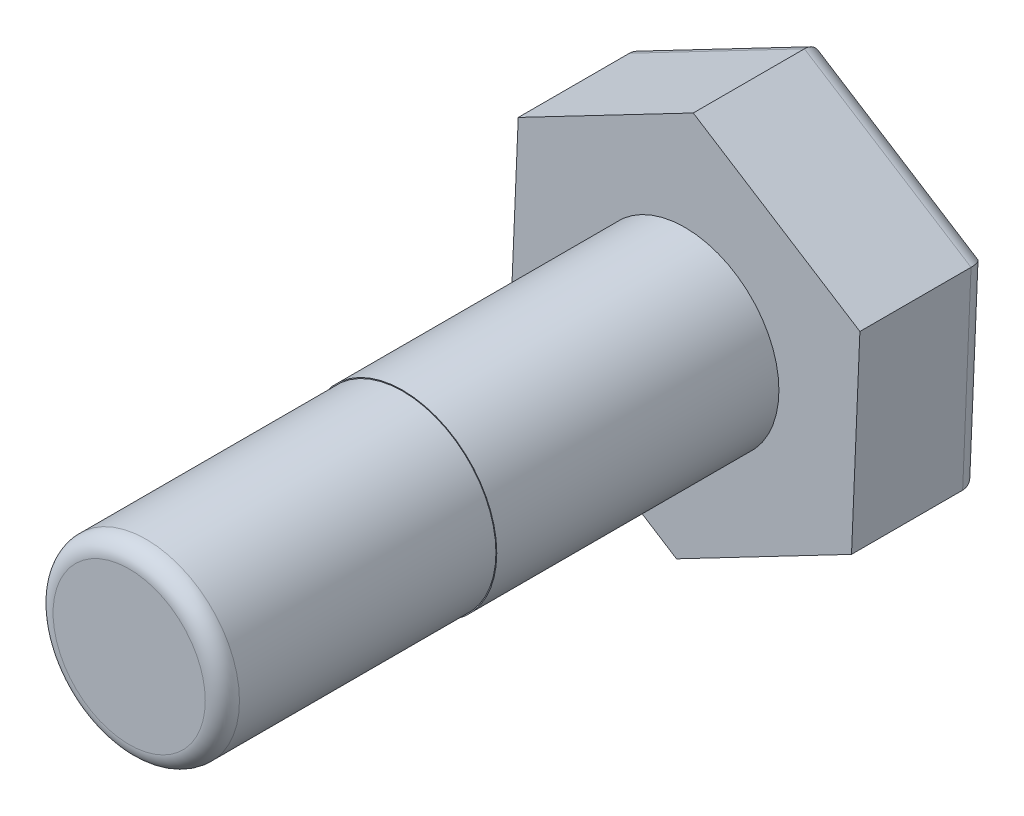
ISO-10303-21;
HEADER;
FILE_DESCRIPTION(('STEP AP214'),'2;1');
FILE_NAME('part.step','',(''),(''),'','','');
FILE_SCHEMA(('AUTOMOTIVE_DESIGN { 1 0 10303 214 1 1 1 1 }'));
ENDSEC;
DATA;
#1=APPLICATION_CONTEXT('core data for automotive mechanical design processes');
#2=APPLICATION_PROTOCOL_DEFINITION('international standard','automotive_design',2000,#1);
#3=PRODUCT_CONTEXT('',#1,'mechanical');
#4=PRODUCT('Part','Part','',(#3));
#5=PRODUCT_RELATED_PRODUCT_CATEGORY('part','',(#4));
#6=PRODUCT_DEFINITION_FORMATION('','',#4);
#7=PRODUCT_DEFINITION_CONTEXT('part definition',#1,'design');
#8=PRODUCT_DEFINITION('design','',#6,#7);
#9=PRODUCT_DEFINITION_SHAPE('','',#8);
#10=(LENGTH_UNIT() NAMED_UNIT(*) SI_UNIT(.MILLI.,.METRE.));
#11=(NAMED_UNIT(*) PLANE_ANGLE_UNIT() SI_UNIT($,.RADIAN.));
#12=(NAMED_UNIT(*) SI_UNIT($,.STERADIAN.) SOLID_ANGLE_UNIT());
#13=UNCERTAINTY_MEASURE_WITH_UNIT(LENGTH_MEASURE(1.E-05),#10,'distance_accuracy_value','');
#14=(GEOMETRIC_REPRESENTATION_CONTEXT(3) GLOBAL_UNCERTAINTY_ASSIGNED_CONTEXT((#13)) GLOBAL_UNIT_ASSIGNED_CONTEXT((#10,
#11,#12)) REPRESENTATION_CONTEXT('',''));
#15=CARTESIAN_POINT('',(0.,0.,0.));
#16=DIRECTION('',(0.,0.,1.));
#17=DIRECTION('',(1.,0.,0.));
#18=AXIS2_PLACEMENT_3D('',#15,#16,#17);
#19=CARTESIAN_POINT('',(0.,0.,48.));
#20=DIRECTION('',(0.,0.,1.));
#21=DIRECTION('',(1.,0.,0.));
#22=AXIS2_PLACEMENT_3D('',#19,#20,#21);
#23=PLANE('',#22);
#24=CARTESIAN_POINT('',(0.,0.,48.));
#25=DIRECTION('',(0.,0.,1.));
#26=DIRECTION('',(1.,0.,0.));
#27=AXIS2_PLACEMENT_3D('',#24,#25,#26);
#28=CIRCLE('',#27,11.);
#29=CARTESIAN_POINT('',(11.,0.,48.));
#30=VERTEX_POINT('',#29);
#31=EDGE_CURVE('E125',#30,#30,#28,.T.);
#32=ORIENTED_EDGE('',*,*,#31,.T.);
#33=EDGE_LOOP('',(#32));
#34=FACE_BOUND('',#33,.T.);
#35=CARTESIAN_POINT('',(0.,0.,48.));
#36=DIRECTION('',(0.,0.,1.));
#37=DIRECTION('',(1.,0.,0.));
#38=AXIS2_PLACEMENT_3D('',#35,#36,#37);
#39=CIRCLE('',#38,10.9);
#40=CARTESIAN_POINT('',(10.9,0.,48.));
#41=VERTEX_POINT('',#40);
#42=EDGE_CURVE('E160',#41,#41,#39,.T.);
#43=ORIENTED_EDGE('',*,*,#42,.F.);
#44=EDGE_LOOP('',(#43));
#45=FACE_BOUND('',#44,.T.);
#46=ADVANCED_FACE('F31',(#34,#45),#23,.T.);
#47=CARTESIAN_POINT('',(21.4532721099387,33.7602890357432,15.));
#48=DIRECTION('',(0.,0.,1.));
#49=DIRECTION('',(1.,0.,0.));
#50=AXIS2_PLACEMENT_3D('',#47,#48,#49);
#51=PLANE('',#50);
#52=DIRECTION('',(0.0424733530908878,0.999097599975707,0.));
#53=VECTOR('',#52,1.);
#54=CARTESIAN_POINT('',(19.4915119627059,-12.3860524276714,15.));
#55=LINE('',#54,#53);
#56=CARTESIAN_POINT('',(19.4915119627059,-12.3860524276714,15.));
#57=VERTEX_POINT('',#56);
#58=CARTESIAN_POINT('',(20.4723920363223,10.6871183040359,15.));
#59=VERTEX_POINT('',#58);
#60=EDGE_CURVE('E117',#57,#59,#55,.T.);
#61=ORIENTED_EDGE('',*,*,#60,.T.);
#62=DIRECTION('',(-0.844007225893581,0.536331802748468,0.));
#63=VECTOR('',#62,1.);
#64=CARTESIAN_POINT('',(20.4723920363223,10.6871183040359,15.));
#65=LINE('',#64,#63);
#66=CARTESIAN_POINT('',(0.980880073616411,23.0731707317073,15.));
#67=VERTEX_POINT('',#66);
#68=EDGE_CURVE('E105',#59,#67,#65,.T.);
#69=ORIENTED_EDGE('',*,*,#68,.T.);
#70=DIRECTION('',(-0.886480578984469,-0.462765797227238,0.));
#71=VECTOR('',#70,1.);
#72=CARTESIAN_POINT('',(0.980880073616411,23.0731707317073,15.));
#73=LINE('',#72,#71);
#74=CARTESIAN_POINT('',(-19.4915119627059,12.3860524276714,15.));
#75=VERTEX_POINT('',#74);
#76=EDGE_CURVE('E116',#67,#75,#73,.T.);
#77=ORIENTED_EDGE('',*,*,#76,.T.);
#78=DIRECTION('',(-0.0424733530908877,-0.999097599975707,0.));
#79=VECTOR('',#78,1.);
#80=CARTESIAN_POINT('',(-19.4915119627059,12.3860524276714,15.));
#81=LINE('',#80,#79);
#82=CARTESIAN_POINT('',(-20.4723920363223,-10.6871183040359,15.));
#83=VERTEX_POINT('',#82);
#84=EDGE_CURVE('E265',#75,#83,#81,.T.);
#85=ORIENTED_EDGE('',*,*,#84,.T.);
#86=DIRECTION('',(0.844007225893581,-0.536331802748469,0.));
#87=VECTOR('',#86,1.);
#88=CARTESIAN_POINT('',(-20.4723920363223,-10.6871183040359,15.));
#89=LINE('',#88,#87);
#90=CARTESIAN_POINT('',(-0.980880073616402,-23.0731707317073,15.));
#91=VERTEX_POINT('',#90);
#92=EDGE_CURVE('E267',#83,#91,#89,.T.);
#93=ORIENTED_EDGE('',*,*,#92,.T.);
#94=DIRECTION('',(0.886480578984469,0.462765797227238,0.));
#95=VECTOR('',#94,1.);
#96=CARTESIAN_POINT('',(-0.980880073616402,-23.0731707317073,15.));
#97=LINE('',#96,#95);
#98=EDGE_CURVE('E123',#91,#57,#97,.T.);
#99=ORIENTED_EDGE('',*,*,#98,.T.);
#100=EDGE_LOOP('',(#61,#69,#77,#85,#93,#99));
#101=FACE_BOUND('',#100,.T.);
#102=CARTESIAN_POINT('',(0.,0.,15.));
#103=DIRECTION('',(0.,0.,1.));
#104=DIRECTION('',(1.,0.,0.));
#105=AXIS2_PLACEMENT_3D('',#102,#103,#104);
#106=CIRCLE('',#105,11.);
#107=CARTESIAN_POINT('',(11.,0.,15.));
#108=VERTEX_POINT('',#107);
#109=EDGE_CURVE('E173',#108,#108,#106,.T.);
#110=ORIENTED_EDGE('',*,*,#109,.F.);
#111=EDGE_LOOP('',(#110));
#112=FACE_BOUND('',#111,.T.);
#113=ADVANCED_FACE('F120',(#101,#112),#51,.T.);
#114=CARTESIAN_POINT('',(19.4915119627059,-12.3860524276714,15.));
#115=DIRECTION('',(-0.999097599975706,0.0424733530908878,0.));
#116=DIRECTION('',(-0.0424733530908878,-0.999097599975706,0.));
#117=AXIS2_PLACEMENT_3D('',#114,#115,#116);
#118=PLANE('',#117);
#119=DIRECTION('',(0.,0.,-1.));
#120=VECTOR('',#119,1.);
#121=CARTESIAN_POINT('',(19.4915119627059,-12.3860524276714,15.));
#122=LINE('',#121,#120);
#123=CARTESIAN_POINT('',(19.4915119627059,-12.3860524276714,2.));
#124=VERTEX_POINT('',#123);
#125=EDGE_CURVE('E272',#57,#124,#122,.T.);
#126=ORIENTED_EDGE('',*,*,#125,.T.);
#127=DIRECTION('',(0.0424733530908878,0.999097599975706,0.));
#128=VECTOR('',#127,1.);
#129=CARTESIAN_POINT('',(19.4915119627059,-12.3860524276714,2.));
#130=LINE('',#129,#128);
#131=CARTESIAN_POINT('',(20.4723920363223,10.6871183040359,2.));
#132=VERTEX_POINT('',#131);
#133=EDGE_CURVE('E129',#124,#132,#130,.T.);
#134=ORIENTED_EDGE('',*,*,#133,.T.);
#135=DIRECTION('',(0.,0.,-1.));
#136=VECTOR('',#135,1.);
#137=CARTESIAN_POINT('',(20.4723920363223,10.6871183040359,15.));
#138=LINE('',#137,#136);
#139=EDGE_CURVE('E110',#59,#132,#138,.T.);
#140=ORIENTED_EDGE('',*,*,#139,.F.);
#141=ORIENTED_EDGE('',*,*,#60,.F.);
#142=EDGE_LOOP('',(#126,#134,#140,#141));
#143=FACE_BOUND('',#142,.T.);
#144=ADVANCED_FACE('F127',(#143),#118,.F.);
#145=CARTESIAN_POINT('',(20.4723920363223,10.6871183040359,15.));
#146=DIRECTION('',(-0.536331802748468,-0.844007225893581,0.));
#147=DIRECTION('',(0.844007225893581,-0.536331802748468,0.));
#148=AXIS2_PLACEMENT_3D('',#145,#146,#147);
#149=PLANE('',#148);
#150=ORIENTED_EDGE('',*,*,#139,.T.);
#151=DIRECTION('',(-0.844007225893581,0.536331802748468,0.));
#152=VECTOR('',#151,1.);
#153=CARTESIAN_POINT('',(20.4723920363223,10.6871183040359,2.));
#154=LINE('',#153,#152);
#155=CARTESIAN_POINT('',(0.980880073616411,23.0731707317073,2.));
#156=VERTEX_POINT('',#155);
#157=EDGE_CURVE('E130',#132,#156,#154,.T.);
#158=ORIENTED_EDGE('',*,*,#157,.T.);
#159=DIRECTION('',(0.,0.,-1.));
#160=VECTOR('',#159,1.);
#161=CARTESIAN_POINT('',(0.980880073616411,23.0731707317073,15.));
#162=LINE('',#161,#160);
#163=EDGE_CURVE('E113',#67,#156,#162,.T.);
#164=ORIENTED_EDGE('',*,*,#163,.F.);
#165=ORIENTED_EDGE('',*,*,#68,.F.);
#166=EDGE_LOOP('',(#150,#158,#164,#165));
#167=FACE_BOUND('',#166,.T.);
#168=ADVANCED_FACE('F107',(#167),#149,.F.);
#169=CARTESIAN_POINT('',(0.980880073616411,23.0731707317073,15.));
#170=DIRECTION('',(0.462765797227238,-0.886480578984469,0.));
#171=DIRECTION('',(0.886480578984469,0.462765797227238,0.));
#172=AXIS2_PLACEMENT_3D('',#169,#170,#171);
#173=PLANE('',#172);
#174=ORIENTED_EDGE('',*,*,#163,.T.);
#175=DIRECTION('',(-0.886480578984469,-0.462765797227238,0.));
#176=VECTOR('',#175,1.);
#177=CARTESIAN_POINT('',(0.980880073616411,23.0731707317073,2.));
#178=LINE('',#177,#176);
#179=CARTESIAN_POINT('',(-19.4915119627059,12.3860524276714,2.));
#180=VERTEX_POINT('',#179);
#181=EDGE_CURVE('E150',#156,#180,#178,.T.);
#182=ORIENTED_EDGE('',*,*,#181,.T.);
#183=DIRECTION('',(0.,0.,-1.));
#184=VECTOR('',#183,1.);
#185=CARTESIAN_POINT('',(-19.4915119627059,12.3860524276714,15.));
#186=LINE('',#185,#184);
#187=EDGE_CURVE('E134',#75,#180,#186,.T.);
#188=ORIENTED_EDGE('',*,*,#187,.F.);
#189=ORIENTED_EDGE('',*,*,#76,.F.);
#190=EDGE_LOOP('',(#174,#182,#188,#189));
#191=FACE_BOUND('',#190,.T.);
#192=ADVANCED_FACE('F216',(#191),#173,.F.);
#193=CARTESIAN_POINT('',(-19.4915119627059,12.3860524276714,15.));
#194=DIRECTION('',(0.999097599975706,-0.0424733530908877,0.));
#195=DIRECTION('',(0.0424733530908877,0.999097599975706,0.));
#196=AXIS2_PLACEMENT_3D('',#193,#194,#195);
#197=PLANE('',#196);
#198=ORIENTED_EDGE('',*,*,#187,.T.);
#199=DIRECTION('',(-0.0424733530908877,-0.999097599975706,0.));
#200=VECTOR('',#199,1.);
#201=CARTESIAN_POINT('',(-19.4915119627059,12.3860524276714,2.));
#202=LINE('',#201,#200);
#203=CARTESIAN_POINT('',(-20.4723920363223,-10.6871183040359,2.));
#204=VERTEX_POINT('',#203);
#205=EDGE_CURVE('E152',#180,#204,#202,.T.);
#206=ORIENTED_EDGE('',*,*,#205,.T.);
#207=DIRECTION('',(0.,0.,-1.));
#208=VECTOR('',#207,1.);
#209=CARTESIAN_POINT('',(-20.4723920363223,-10.6871183040359,15.));
#210=LINE('',#209,#208);
#211=EDGE_CURVE('E276',#83,#204,#210,.T.);
#212=ORIENTED_EDGE('',*,*,#211,.F.);
#213=ORIENTED_EDGE('',*,*,#84,.F.);
#214=EDGE_LOOP('',(#198,#206,#212,#213));
#215=FACE_BOUND('',#214,.T.);
#216=ADVANCED_FACE('F213',(#215),#197,.F.);
#217=CARTESIAN_POINT('',(-20.4723920363223,-10.6871183040359,15.));
#218=DIRECTION('',(0.536331802748468,0.844007225893581,0.));
#219=DIRECTION('',(-0.844007225893581,0.536331802748468,0.));
#220=AXIS2_PLACEMENT_3D('',#217,#218,#219);
#221=PLANE('',#220);
#222=ORIENTED_EDGE('',*,*,#211,.T.);
#223=DIRECTION('',(0.844007225893581,-0.536331802748468,0.));
#224=VECTOR('',#223,1.);
#225=CARTESIAN_POINT('',(-20.4723920363223,-10.6871183040359,2.));
#226=LINE('',#225,#224);
#227=CARTESIAN_POINT('',(-0.980880073616402,-23.0731707317073,2.));
#228=VERTEX_POINT('',#227);
#229=EDGE_CURVE('E54',#204,#228,#226,.T.);
#230=ORIENTED_EDGE('',*,*,#229,.T.);
#231=DIRECTION('',(0.,0.,-1.));
#232=VECTOR('',#231,1.);
#233=CARTESIAN_POINT('',(-0.980880073616402,-23.0731707317073,15.));
#234=LINE('',#233,#232);
#235=EDGE_CURVE('E274',#91,#228,#234,.T.);
#236=ORIENTED_EDGE('',*,*,#235,.F.);
#237=ORIENTED_EDGE('',*,*,#92,.F.);
#238=EDGE_LOOP('',(#222,#230,#236,#237));
#239=FACE_BOUND('',#238,.T.);
#240=ADVANCED_FACE('F210',(#239),#221,.F.);
#241=CARTESIAN_POINT('',(-0.980880073616402,-23.0731707317073,15.));
#242=DIRECTION('',(-0.462765797227238,0.886480578984469,0.));
#243=DIRECTION('',(-0.886480578984469,-0.462765797227238,0.));
#244=AXIS2_PLACEMENT_3D('',#241,#242,#243);
#245=PLANE('',#244);
#246=ORIENTED_EDGE('',*,*,#235,.T.);
#247=DIRECTION('',(0.886480578984469,0.462765797227238,0.));
#248=VECTOR('',#247,1.);
#249=CARTESIAN_POINT('',(-0.980880073616402,-23.0731707317073,2.));
#250=LINE('',#249,#248);
#251=EDGE_CURVE('E46',#228,#124,#250,.T.);
#252=ORIENTED_EDGE('',*,*,#251,.T.);
#253=ORIENTED_EDGE('',*,*,#125,.F.);
#254=ORIENTED_EDGE('',*,*,#98,.F.);
#255=EDGE_LOOP('',(#246,#252,#253,#254));
#256=FACE_BOUND('',#255,.T.);
#257=ADVANCED_FACE('F206',(#256),#245,.F.);
#258=CARTESIAN_POINT('',(21.4532721099387,33.7602890357432,0.));
#259=DIRECTION('',(0.,0.,1.));
#260=DIRECTION('',(1.,0.,0.));
#261=AXIS2_PLACEMENT_3D('',#258,#259,#260);
#262=PLANE('',#261);
#263=DIRECTION('',(-0.886480578984469,-0.462765797227238,0.));
#264=VECTOR('',#263,1.);
#265=CARTESIAN_POINT('',(22.3788037043932,31.9873278777743,0.));
#266=LINE('',#265,#264);
#267=CARTESIAN_POINT('',(-17.5423607664353,11.1474471849043,0.));
#268=VERTEX_POINT('',#267);
#269=CARTESIAN_POINT('',(0.882792066254768,20.7658536585366,0.));
#270=VERTEX_POINT('',#269);
#271=EDGE_CURVE('E145',#268,#270,#266,.F.);
#272=ORIENTED_EDGE('',*,*,#271,.T.);
#273=DIRECTION('',(-0.844007225893581,0.536331802748468,0.));
#274=VECTOR('',#273,1.);
#275=CARTESIAN_POINT('',(9.65397244947244,15.1921300660844,0.));
#276=LINE('',#275,#274);
#277=CARTESIAN_POINT('',(18.4251528326901,9.61840647363232,0.));
#278=VERTEX_POINT('',#277);
#279=EDGE_CURVE('E147',#270,#278,#276,.F.);
#280=ORIENTED_EDGE('',*,*,#279,.T.);
#281=DIRECTION('',(0.0424733530908878,0.999097599975706,0.));
#282=VECTOR('',#281,1.);
#283=CARTESIAN_POINT('',(19.4550769099873,33.845235741925,0.));
#284=LINE('',#283,#282);
#285=CARTESIAN_POINT('',(17.5423607664353,-11.1474471849043,0.));
#286=VERTEX_POINT('',#285);
#287=EDGE_CURVE('E132',#278,#286,#284,.F.);
#288=ORIENTED_EDGE('',*,*,#287,.T.);
#289=DIRECTION('',(0.886480578984469,0.462765797227238,0.));
#290=VECTOR('',#289,1.);
#291=CARTESIAN_POINT('',(39.0383724045738,0.0740270343334015,0.));
#292=LINE('',#291,#290);
#293=CARTESIAN_POINT('',(-0.882792066254761,-20.7658536585366,0.));
#294=VERTEX_POINT('',#293);
#295=EDGE_CURVE('E139',#286,#294,#292,.F.);
#296=ORIENTED_EDGE('',*,*,#295,.T.);
#297=DIRECTION('',(0.844007225893581,-0.536331802748468,0.));
#298=VECTOR('',#297,1.);
#299=CARTESIAN_POINT('',(-9.65397244947243,-15.1921300660844,0.));
#300=LINE('',#299,#298);
#301=CARTESIAN_POINT('',(-18.4251528326901,-9.61840647363232,0.));
#302=VERTEX_POINT('',#301);
#303=EDGE_CURVE('E141',#294,#302,#300,.F.);
#304=ORIENTED_EDGE('',*,*,#303,.T.);
#305=DIRECTION('',(-0.0424733530908877,-0.999097599975706,0.));
#306=VECTOR('',#305,1.);
#307=CARTESIAN_POINT('',(-16.5124366891381,35.374276453197,0.));
#308=LINE('',#307,#306);
#309=EDGE_CURVE('E143',#302,#268,#308,.F.);
#310=ORIENTED_EDGE('',*,*,#309,.T.);
#311=EDGE_LOOP('',(#272,#280,#288,#296,#304,#310));
#312=FACE_BOUND('',#311,.T.);
#313=ADVANCED_FACE('F201',(#312),#262,.F.);
#314=CARTESIAN_POINT('',(0.,0.,48.));
#315=DIRECTION('',(0.,0.,-1.));
#316=DIRECTION('',(-1.,0.,0.));
#317=AXIS2_PLACEMENT_3D('',#314,#315,#316);
#318=CYLINDRICAL_SURFACE('',#317,11.);
#319=ORIENTED_EDGE('',*,*,#31,.F.);
#320=EDGE_LOOP('',(#319));
#321=FACE_BOUND('',#320,.T.);
#322=ORIENTED_EDGE('',*,*,#109,.T.);
#323=EDGE_LOOP('',(#322));
#324=FACE_BOUND('',#323,.T.);
#325=ADVANCED_FACE('F198',(#321,#324),#318,.T.);
#326=CARTESIAN_POINT('',(-19.3997284308254,-8.99910385224874,2.));
#327=DIRECTION('',(0.844007225893581,-0.536331802748468,0.));
#328=DIRECTION('',(0.536331802748468,0.844007225893581,0.));
#329=AXIS2_PLACEMENT_3D('',#326,#327,#328);
#330=CYLINDRICAL_SURFACE('',#329,2.);
#331=CARTESIAN_POINT('',(-18.4251528326901,-9.61840647363232,2.));
#332=DIRECTION('',(0.462765797227238,-0.886480578984469,0.));
#333=DIRECTION('',(0.886480578984469,0.462765797227238,0.));
#334=AXIS2_PLACEMENT_3D('',#331,#332,#333);
#335=ELLIPSE('',#334,2.3094010767585,2.);
#336=EDGE_CURVE('E168',#302,#204,#335,.F.);
#337=ORIENTED_EDGE('',*,*,#336,.F.);
#338=ORIENTED_EDGE('',*,*,#303,.F.);
#339=CARTESIAN_POINT('',(-0.882792066254761,-20.7658536585366,2.));
#340=DIRECTION('',(0.999097599975706,-0.042473353090888,0.));
#341=DIRECTION('',(0.042473353090888,0.999097599975707,0.));
#342=AXIS2_PLACEMENT_3D('',#339,#340,#341);
#343=ELLIPSE('',#342,2.3094010767585,2.);
#344=EDGE_CURVE('E171',#228,#294,#343,.T.);
#345=ORIENTED_EDGE('',*,*,#344,.F.);
#346=ORIENTED_EDGE('',*,*,#229,.F.);
#347=EDGE_LOOP('',(#337,#338,#345,#346));
#348=FACE_BOUND('',#347,.T.);
#349=ADVANCED_FACE('F200',(#348),#330,.T.);
#350=CARTESIAN_POINT('',(-1.90641166807088,-21.3002095737384,2.));
#351=DIRECTION('',(0.886480578984469,0.462765797227238,0.));
#352=DIRECTION('',(-0.462765797227238,0.886480578984469,0.));
#353=AXIS2_PLACEMENT_3D('',#350,#351,#352);
#354=CYLINDRICAL_SURFACE('',#353,2.);
#355=ORIENTED_EDGE('',*,*,#344,.T.);
#356=ORIENTED_EDGE('',*,*,#295,.F.);
#357=CARTESIAN_POINT('',(17.5423607664353,-11.1474471849043,2.));
#358=DIRECTION('',(0.536331802748468,0.844007225893581,0.));
#359=DIRECTION('',(-0.844007225893581,0.536331802748469,0.));
#360=AXIS2_PLACEMENT_3D('',#357,#358,#359);
#361=ELLIPSE('',#360,2.3094010767585,2.);
#362=EDGE_CURVE('E165',#124,#286,#361,.T.);
#363=ORIENTED_EDGE('',*,*,#362,.F.);
#364=ORIENTED_EDGE('',*,*,#251,.F.);
#365=EDGE_LOOP('',(#355,#356,#363,#364));
#366=FACE_BOUND('',#365,.T.);
#367=ADVANCED_FACE('F240',(#366),#354,.T.);
#368=CARTESIAN_POINT('',(-17.4933167627545,12.3011057214896,2.));
#369=DIRECTION('',(-0.0424733530908877,-0.999097599975706,0.));
#370=DIRECTION('',(0.999097599975706,-0.0424733530908877,0.));
#371=AXIS2_PLACEMENT_3D('',#368,#369,#370);
#372=CYLINDRICAL_SURFACE('',#371,2.);
#373=ORIENTED_EDGE('',*,*,#336,.T.);
#374=ORIENTED_EDGE('',*,*,#205,.F.);
#375=CARTESIAN_POINT('',(-17.5423607664353,11.1474471849043,2.));
#376=DIRECTION('',(-0.536331802748468,-0.844007225893581,0.));
#377=DIRECTION('',(0.844007225893581,-0.536331802748468,0.));
#378=AXIS2_PLACEMENT_3D('',#375,#376,#377);
#379=ELLIPSE('',#378,2.3094010767585,2.);
#380=EDGE_CURVE('E162',#268,#180,#379,.F.);
#381=ORIENTED_EDGE('',*,*,#380,.F.);
#382=ORIENTED_EDGE('',*,*,#309,.F.);
#383=EDGE_LOOP('',(#373,#374,#381,#382));
#384=FACE_BOUND('',#383,.T.);
#385=ADVANCED_FACE('F236',(#384),#372,.T.);
#386=CARTESIAN_POINT('',(17.4933167627545,-12.3011057214897,2.));
#387=DIRECTION('',(0.0424733530908878,0.999097599975706,0.));
#388=DIRECTION('',(-0.999097599975706,0.0424733530908878,0.));
#389=AXIS2_PLACEMENT_3D('',#386,#387,#388);
#390=CYLINDRICAL_SURFACE('',#389,2.);
#391=ORIENTED_EDGE('',*,*,#362,.T.);
#392=ORIENTED_EDGE('',*,*,#287,.F.);
#393=CARTESIAN_POINT('',(18.4251528326901,9.61840647363231,2.));
#394=DIRECTION('',(-0.462765797227238,0.886480578984469,0.));
#395=DIRECTION('',(0.886480578984469,0.462765797227238,0.));
#396=AXIS2_PLACEMENT_3D('',#393,#394,#395);
#397=ELLIPSE('',#396,2.3094010767585,2.);
#398=EDGE_CURVE('E159',#132,#278,#397,.T.);
#399=ORIENTED_EDGE('',*,*,#398,.F.);
#400=ORIENTED_EDGE('',*,*,#133,.F.);
#401=EDGE_LOOP('',(#391,#392,#399,#400));
#402=FACE_BOUND('',#401,.T.);
#403=ADVANCED_FACE('F232',(#402),#390,.T.);
#404=CARTESIAN_POINT('',(1.90641166807089,21.3002095737384,2.));
#405=DIRECTION('',(-0.886480578984469,-0.462765797227238,0.));
#406=DIRECTION('',(0.462765797227238,-0.886480578984469,0.));
#407=AXIS2_PLACEMENT_3D('',#404,#405,#406);
#408=CYLINDRICAL_SURFACE('',#407,2.);
#409=ORIENTED_EDGE('',*,*,#380,.T.);
#410=ORIENTED_EDGE('',*,*,#181,.F.);
#411=CARTESIAN_POINT('',(0.882792066254761,20.7658536585366,2.));
#412=DIRECTION('',(-0.999097599975706,0.042473353090888,0.));
#413=DIRECTION('',(-0.0424733530908879,-0.999097599975706,0.));
#414=AXIS2_PLACEMENT_3D('',#411,#412,#413);
#415=ELLIPSE('',#414,2.3094010767585,2.);
#416=EDGE_CURVE('E157',#270,#156,#415,.F.);
#417=ORIENTED_EDGE('',*,*,#416,.F.);
#418=ORIENTED_EDGE('',*,*,#271,.F.);
#419=EDGE_LOOP('',(#409,#410,#417,#418));
#420=FACE_BOUND('',#419,.T.);
#421=ADVANCED_FACE('F228',(#420),#408,.T.);
#422=CARTESIAN_POINT('',(19.3997284308254,8.99910385224875,2.));
#423=DIRECTION('',(-0.844007225893581,0.536331802748468,0.));
#424=DIRECTION('',(-0.536331802748468,-0.844007225893581,0.));
#425=AXIS2_PLACEMENT_3D('',#422,#423,#424);
#426=CYLINDRICAL_SURFACE('',#425,2.);
#427=ORIENTED_EDGE('',*,*,#398,.T.);
#428=ORIENTED_EDGE('',*,*,#279,.F.);
#429=ORIENTED_EDGE('',*,*,#416,.T.);
#430=ORIENTED_EDGE('',*,*,#157,.F.);
#431=EDGE_LOOP('',(#427,#428,#429,#430));
#432=FACE_BOUND('',#431,.T.);
#433=ADVANCED_FACE('F225',(#432),#426,.T.);
#434=CARTESIAN_POINT('',(0.,0.,80.));
#435=DIRECTION('',(0.,0.,-1.));
#436=DIRECTION('',(-1.,0.,0.));
#437=AXIS2_PLACEMENT_3D('',#434,#435,#436);
#438=CYLINDRICAL_SURFACE('',#437,10.9);
#439=CARTESIAN_POINT('',(0.,0.,78.));
#440=DIRECTION('',(0.,0.,1.));
#441=DIRECTION('',(1.,0.,0.));
#442=AXIS2_PLACEMENT_3D('',#439,#440,#441);
#443=CIRCLE('',#442,10.9);
#444=CARTESIAN_POINT('',(10.9,0.,78.));
#445=VERTEX_POINT('',#444);
#446=EDGE_CURVE('E11',#445,#445,#443,.F.);
#447=ORIENTED_EDGE('',*,*,#446,.T.);
#448=EDGE_LOOP('',(#447));
#449=FACE_BOUND('',#448,.T.);
#450=ORIENTED_EDGE('',*,*,#42,.T.);
#451=EDGE_LOOP('',(#450));
#452=FACE_BOUND('',#451,.T.);
#453=ADVANCED_FACE('F184',(#449,#452),#438,.T.);
#454=CARTESIAN_POINT('',(0.,0.,80.));
#455=DIRECTION('',(0.,0.,1.));
#456=DIRECTION('',(1.,0.,0.));
#457=AXIS2_PLACEMENT_3D('',#454,#455,#456);
#458=PLANE('',#457);
#459=CARTESIAN_POINT('',(0.,0.,80.));
#460=DIRECTION('',(0.,0.,1.));
#461=DIRECTION('',(1.,0.,0.));
#462=AXIS2_PLACEMENT_3D('',#459,#460,#461);
#463=CIRCLE('',#462,8.9);
#464=CARTESIAN_POINT('',(8.9,0.,80.));
#465=VERTEX_POINT('',#464);
#466=EDGE_CURVE('E39',#465,#465,#463,.T.);
#467=ORIENTED_EDGE('',*,*,#466,.T.);
#468=EDGE_LOOP('',(#467));
#469=FACE_BOUND('',#468,.T.);
#470=ADVANCED_FACE('F177',(#469),#458,.T.);
#471=CARTESIAN_POINT('',(0.,0.,78.));
#472=DIRECTION('',(0.,0.,1.));
#473=DIRECTION('',(1.,0.,0.));
#474=AXIS2_PLACEMENT_3D('',#471,#472,#473);
#475=TOROIDAL_SURFACE('',#474,8.9,2.);
#476=ORIENTED_EDGE('',*,*,#446,.F.);
#477=EDGE_LOOP('',(#476));
#478=FACE_BOUND('',#477,.T.);
#479=ORIENTED_EDGE('',*,*,#466,.F.);
#480=EDGE_LOOP('',(#479));
#481=FACE_BOUND('',#480,.T.);
#482=ADVANCED_FACE('F33',(#478,#481),#475,.T.);
#483=CLOSED_SHELL('',(#46,#113,#144,#168,#192,#216,#240,#257,#313,#325,#349,#367,#385,#403,#421,
#433,#453,#470,#482));
#484=MANIFOLD_SOLID_BREP('B2',#483);
#485=ADVANCED_BREP_SHAPE_REPRESENTATION('',(#18,#484),#14);
#486=SHAPE_DEFINITION_REPRESENTATION(#9,#485);
ENDSEC;
END-ISO-10303-21;
